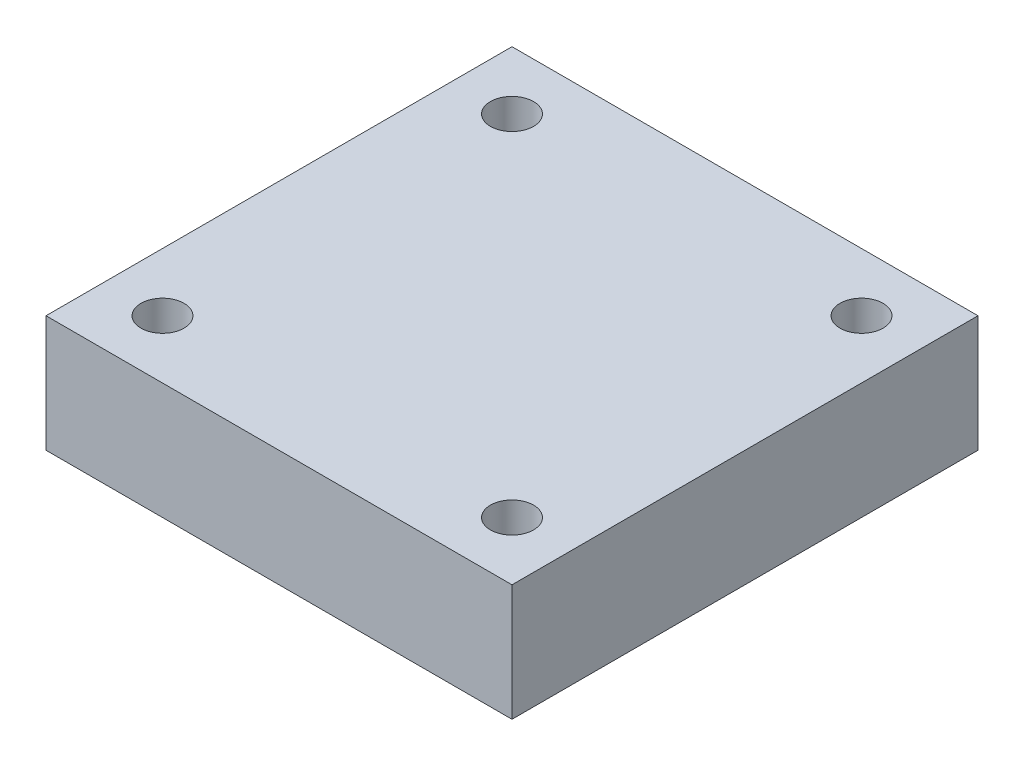
ISO-10303-21;
HEADER;
FILE_DESCRIPTION(('STEP AP214'),'2;1');
FILE_NAME('part.step','',(''),(''),'','','');
FILE_SCHEMA(('AUTOMOTIVE_DESIGN { 1 0 10303 214 1 1 1 1 }'));
ENDSEC;
DATA;
#1=APPLICATION_CONTEXT('core data for automotive mechanical design processes');
#2=APPLICATION_PROTOCOL_DEFINITION('international standard','automotive_design',2000,#1);
#3=PRODUCT_CONTEXT('',#1,'mechanical');
#4=PRODUCT('Part','Part','',(#3));
#5=PRODUCT_RELATED_PRODUCT_CATEGORY('part','',(#4));
#6=PRODUCT_DEFINITION_FORMATION('','',#4);
#7=PRODUCT_DEFINITION_CONTEXT('part definition',#1,'design');
#8=PRODUCT_DEFINITION('design','',#6,#7);
#9=PRODUCT_DEFINITION_SHAPE('','',#8);
#10=(LENGTH_UNIT() NAMED_UNIT(*) SI_UNIT(.MILLI.,.METRE.));
#11=(NAMED_UNIT(*) PLANE_ANGLE_UNIT() SI_UNIT($,.RADIAN.));
#12=(NAMED_UNIT(*) SI_UNIT($,.STERADIAN.) SOLID_ANGLE_UNIT());
#13=UNCERTAINTY_MEASURE_WITH_UNIT(LENGTH_MEASURE(1.E-05),#10,'distance_accuracy_value','');
#14=(GEOMETRIC_REPRESENTATION_CONTEXT(3) GLOBAL_UNCERTAINTY_ASSIGNED_CONTEXT((#13)) GLOBAL_UNIT_ASSIGNED_CONTEXT((#10,
#11,#12)) REPRESENTATION_CONTEXT('',''));
#15=CARTESIAN_POINT('',(0.,0.,0.));
#16=DIRECTION('',(0.,0.,1.));
#17=DIRECTION('',(1.,0.,0.));
#18=AXIS2_PLACEMENT_3D('',#15,#16,#17);
#19=CARTESIAN_POINT('',(0.,10.,0.));
#20=DIRECTION('',(0.,-1.,0.));
#21=DIRECTION('',(0.,0.,-1.));
#22=AXIS2_PLACEMENT_3D('',#19,#20,#21);
#23=PLANE('',#22);
#24=DIRECTION('',(0.,0.,-1.));
#25=VECTOR('',#24,1.);
#26=CARTESIAN_POINT('',(20.,10.,20.));
#27=LINE('',#26,#25);
#28=CARTESIAN_POINT('',(20.,10.,20.));
#29=VERTEX_POINT('',#28);
#30=CARTESIAN_POINT('',(20.,10.,-20.));
#31=VERTEX_POINT('',#30);
#32=EDGE_CURVE('E92',#29,#31,#27,.T.);
#33=ORIENTED_EDGE('',*,*,#32,.T.);
#34=DIRECTION('',(-1.,0.,0.));
#35=VECTOR('',#34,1.);
#36=CARTESIAN_POINT('',(-20.,10.,-20.));
#37=LINE('',#36,#35);
#38=CARTESIAN_POINT('',(-20.,10.,-20.));
#39=VERTEX_POINT('',#38);
#40=EDGE_CURVE('E87',#31,#39,#37,.T.);
#41=ORIENTED_EDGE('',*,*,#40,.T.);
#42=DIRECTION('',(0.,0.,1.));
#43=VECTOR('',#42,1.);
#44=CARTESIAN_POINT('',(-20.,10.,20.));
#45=LINE('',#44,#43);
#46=CARTESIAN_POINT('',(-20.,10.,20.));
#47=VERTEX_POINT('',#46);
#48=EDGE_CURVE('E90',#39,#47,#45,.T.);
#49=ORIENTED_EDGE('',*,*,#48,.T.);
#50=DIRECTION('',(1.,0.,0.));
#51=VECTOR('',#50,1.);
#52=CARTESIAN_POINT('',(-20.,10.,20.));
#53=LINE('',#52,#51);
#54=EDGE_CURVE('E57',#47,#29,#53,.T.);
#55=ORIENTED_EDGE('',*,*,#54,.T.);
#56=EDGE_LOOP('',(#33,#41,#49,#55));
#57=FACE_BOUND('',#56,.T.);
#58=CARTESIAN_POINT('',(-15.,10.,-15.));
#59=DIRECTION('',(0.,1.,0.));
#60=DIRECTION('',(0.,0.,1.));
#61=AXIS2_PLACEMENT_3D('',#58,#59,#60);
#62=CIRCLE('',#61,1.85);
#63=CARTESIAN_POINT('',(-15.,10.,-13.15));
#64=VERTEX_POINT('',#63);
#65=EDGE_CURVE('E112',#64,#64,#62,.T.);
#66=ORIENTED_EDGE('',*,*,#65,.F.);
#67=EDGE_LOOP('',(#66));
#68=FACE_BOUND('',#67,.T.);
#69=CARTESIAN_POINT('',(15.,10.,15.));
#70=DIRECTION('',(0.,1.,0.));
#71=DIRECTION('',(0.,0.,-1.));
#72=AXIS2_PLACEMENT_3D('',#69,#70,#71);
#73=CIRCLE('',#72,1.85000000000001);
#74=CARTESIAN_POINT('',(15.,10.,13.15));
#75=VERTEX_POINT('',#74);
#76=EDGE_CURVE('E134',#75,#75,#73,.T.);
#77=ORIENTED_EDGE('',*,*,#76,.F.);
#78=EDGE_LOOP('',(#77));
#79=FACE_BOUND('',#78,.T.);
#80=CARTESIAN_POINT('',(15.,10.,-15.));
#81=DIRECTION('',(0.,1.,0.));
#82=DIRECTION('',(0.,0.,1.));
#83=AXIS2_PLACEMENT_3D('',#80,#81,#82);
#84=CIRCLE('',#83,1.85000000000001);
#85=CARTESIAN_POINT('',(15.,10.,-13.15));
#86=VERTEX_POINT('',#85);
#87=EDGE_CURVE('E142',#86,#86,#84,.T.);
#88=ORIENTED_EDGE('',*,*,#87,.F.);
#89=EDGE_LOOP('',(#88));
#90=FACE_BOUND('',#89,.T.);
#91=CARTESIAN_POINT('',(-15.,10.,15.));
#92=DIRECTION('',(0.,1.,0.));
#93=DIRECTION('',(0.,0.,-1.));
#94=AXIS2_PLACEMENT_3D('',#91,#92,#93);
#95=CIRCLE('',#94,1.85);
#96=CARTESIAN_POINT('',(-15.,10.,13.15));
#97=VERTEX_POINT('',#96);
#98=EDGE_CURVE('E150',#97,#97,#95,.T.);
#99=ORIENTED_EDGE('',*,*,#98,.F.);
#100=EDGE_LOOP('',(#99));
#101=FACE_BOUND('',#100,.T.);
#102=ADVANCED_FACE('F39',(#57,#68,#79,#90,#101),#23,.F.);
#103=CARTESIAN_POINT('',(0.,0.,0.));
#104=DIRECTION('',(0.,-1.,0.));
#105=DIRECTION('',(0.,0.,-1.));
#106=AXIS2_PLACEMENT_3D('',#103,#104,#105);
#107=PLANE('',#106);
#108=CARTESIAN_POINT('',(15.,0.,-15.));
#109=DIRECTION('',(0.,1.,0.));
#110=DIRECTION('',(0.,0.,1.));
#111=AXIS2_PLACEMENT_3D('',#108,#109,#110);
#112=CIRCLE('',#111,1.85000000000001);
#113=CARTESIAN_POINT('',(15.,0.,-13.15));
#114=VERTEX_POINT('',#113);
#115=EDGE_CURVE('E146',#114,#114,#112,.T.);
#116=ORIENTED_EDGE('',*,*,#115,.T.);
#117=EDGE_LOOP('',(#116));
#118=FACE_BOUND('',#117,.T.);
#119=CARTESIAN_POINT('',(-15.,0.,-15.));
#120=DIRECTION('',(0.,1.,0.));
#121=DIRECTION('',(0.,0.,1.));
#122=AXIS2_PLACEMENT_3D('',#119,#120,#121);
#123=CIRCLE('',#122,1.85);
#124=CARTESIAN_POINT('',(-15.,0.,-13.15));
#125=VERTEX_POINT('',#124);
#126=EDGE_CURVE('E130',#125,#125,#123,.T.);
#127=ORIENTED_EDGE('',*,*,#126,.T.);
#128=EDGE_LOOP('',(#127));
#129=FACE_BOUND('',#128,.T.);
#130=DIRECTION('',(0.,0.,-1.));
#131=VECTOR('',#130,1.);
#132=CARTESIAN_POINT('',(20.,0.,20.));
#133=LINE('',#132,#131);
#134=CARTESIAN_POINT('',(20.,0.,20.));
#135=VERTEX_POINT('',#134);
#136=CARTESIAN_POINT('',(20.,0.,-20.));
#137=VERTEX_POINT('',#136);
#138=EDGE_CURVE('E108',#135,#137,#133,.T.);
#139=ORIENTED_EDGE('',*,*,#138,.F.);
#140=DIRECTION('',(1.,0.,0.));
#141=VECTOR('',#140,1.);
#142=CARTESIAN_POINT('',(-20.,0.,20.));
#143=LINE('',#142,#141);
#144=CARTESIAN_POINT('',(-20.,0.,20.));
#145=VERTEX_POINT('',#144);
#146=EDGE_CURVE('E80',#145,#135,#143,.T.);
#147=ORIENTED_EDGE('',*,*,#146,.F.);
#148=DIRECTION('',(0.,0.,1.));
#149=VECTOR('',#148,1.);
#150=CARTESIAN_POINT('',(-20.,0.,20.));
#151=LINE('',#150,#149);
#152=CARTESIAN_POINT('',(-20.,0.,-20.));
#153=VERTEX_POINT('',#152);
#154=EDGE_CURVE('E74',#153,#145,#151,.T.);
#155=ORIENTED_EDGE('',*,*,#154,.F.);
#156=DIRECTION('',(-1.,0.,0.));
#157=VECTOR('',#156,1.);
#158=CARTESIAN_POINT('',(-20.,0.,-20.));
#159=LINE('',#158,#157);
#160=EDGE_CURVE('E97',#137,#153,#159,.T.);
#161=ORIENTED_EDGE('',*,*,#160,.F.);
#162=EDGE_LOOP('',(#139,#147,#155,#161));
#163=FACE_BOUND('',#162,.T.);
#164=CARTESIAN_POINT('',(15.,0.,15.));
#165=DIRECTION('',(0.,1.,0.));
#166=DIRECTION('',(0.,0.,-1.));
#167=AXIS2_PLACEMENT_3D('',#164,#165,#166);
#168=CIRCLE('',#167,1.85000000000001);
#169=CARTESIAN_POINT('',(15.,0.,13.15));
#170=VERTEX_POINT('',#169);
#171=EDGE_CURVE('E138',#170,#170,#168,.T.);
#172=ORIENTED_EDGE('',*,*,#171,.T.);
#173=EDGE_LOOP('',(#172));
#174=FACE_BOUND('',#173,.T.);
#175=CARTESIAN_POINT('',(-15.,0.,15.));
#176=DIRECTION('',(0.,1.,0.));
#177=DIRECTION('',(0.,0.,-1.));
#178=AXIS2_PLACEMENT_3D('',#175,#176,#177);
#179=CIRCLE('',#178,1.85);
#180=CARTESIAN_POINT('',(-15.,0.,13.15));
#181=VERTEX_POINT('',#180);
#182=EDGE_CURVE('E154',#181,#181,#179,.T.);
#183=ORIENTED_EDGE('',*,*,#182,.T.);
#184=EDGE_LOOP('',(#183));
#185=FACE_BOUND('',#184,.T.);
#186=ADVANCED_FACE('F125',(#118,#129,#163,#174,#185),#107,.T.);
#187=CARTESIAN_POINT('',(20.,10.,20.));
#188=DIRECTION('',(-1.,0.,0.));
#189=DIRECTION('',(0.,0.,1.));
#190=AXIS2_PLACEMENT_3D('',#187,#188,#189);
#191=PLANE('',#190);
#192=ORIENTED_EDGE('',*,*,#138,.T.);
#193=DIRECTION('',(0.,-1.,0.));
#194=VECTOR('',#193,1.);
#195=CARTESIAN_POINT('',(20.,10.,-20.));
#196=LINE('',#195,#194);
#197=EDGE_CURVE('E11',#31,#137,#196,.T.);
#198=ORIENTED_EDGE('',*,*,#197,.F.);
#199=ORIENTED_EDGE('',*,*,#32,.F.);
#200=DIRECTION('',(0.,-1.,0.));
#201=VECTOR('',#200,1.);
#202=CARTESIAN_POINT('',(20.,10.,20.));
#203=LINE('',#202,#201);
#204=EDGE_CURVE('E104',#29,#135,#203,.T.);
#205=ORIENTED_EDGE('',*,*,#204,.T.);
#206=EDGE_LOOP('',(#192,#198,#199,#205));
#207=FACE_BOUND('',#206,.T.);
#208=ADVANCED_FACE('F41',(#207),#191,.F.);
#209=CARTESIAN_POINT('',(-20.,10.,-20.));
#210=DIRECTION('',(0.,0.,1.));
#211=DIRECTION('',(1.,0.,0.));
#212=AXIS2_PLACEMENT_3D('',#209,#210,#211);
#213=PLANE('',#212);
#214=ORIENTED_EDGE('',*,*,#160,.T.);
#215=DIRECTION('',(0.,-1.,0.));
#216=VECTOR('',#215,1.);
#217=CARTESIAN_POINT('',(-20.,10.,-20.));
#218=LINE('',#217,#216);
#219=EDGE_CURVE('E49',#39,#153,#218,.T.);
#220=ORIENTED_EDGE('',*,*,#219,.F.);
#221=ORIENTED_EDGE('',*,*,#40,.F.);
#222=ORIENTED_EDGE('',*,*,#197,.T.);
#223=EDGE_LOOP('',(#214,#220,#221,#222));
#224=FACE_BOUND('',#223,.T.);
#225=ADVANCED_FACE('F96',(#224),#213,.F.);
#226=CARTESIAN_POINT('',(-20.,10.,20.));
#227=DIRECTION('',(1.,0.,0.));
#228=DIRECTION('',(0.,0.,-1.));
#229=AXIS2_PLACEMENT_3D('',#226,#227,#228);
#230=PLANE('',#229);
#231=ORIENTED_EDGE('',*,*,#154,.T.);
#232=DIRECTION('',(0.,-1.,0.));
#233=VECTOR('',#232,1.);
#234=CARTESIAN_POINT('',(-20.,10.,20.));
#235=LINE('',#234,#233);
#236=EDGE_CURVE('E99',#47,#145,#235,.T.);
#237=ORIENTED_EDGE('',*,*,#236,.F.);
#238=ORIENTED_EDGE('',*,*,#48,.F.);
#239=ORIENTED_EDGE('',*,*,#219,.T.);
#240=EDGE_LOOP('',(#231,#237,#238,#239));
#241=FACE_BOUND('',#240,.T.);
#242=ADVANCED_FACE('F100',(#241),#230,.F.);
#243=CARTESIAN_POINT('',(-20.,10.,20.));
#244=DIRECTION('',(0.,0.,-1.));
#245=DIRECTION('',(-1.,0.,0.));
#246=AXIS2_PLACEMENT_3D('',#243,#244,#245);
#247=PLANE('',#246);
#248=ORIENTED_EDGE('',*,*,#146,.T.);
#249=ORIENTED_EDGE('',*,*,#204,.F.);
#250=ORIENTED_EDGE('',*,*,#54,.F.);
#251=ORIENTED_EDGE('',*,*,#236,.T.);
#252=EDGE_LOOP('',(#248,#249,#250,#251));
#253=FACE_BOUND('',#252,.T.);
#254=ADVANCED_FACE('F122',(#253),#247,.F.);
#255=CARTESIAN_POINT('',(-15.,10.,-15.));
#256=DIRECTION('',(0.,-1.,0.));
#257=DIRECTION('',(0.,0.,-1.));
#258=AXIS2_PLACEMENT_3D('',#255,#256,#257);
#259=CYLINDRICAL_SURFACE('',#258,1.85);
#260=ORIENTED_EDGE('',*,*,#65,.T.);
#261=EDGE_LOOP('',(#260));
#262=FACE_BOUND('',#261,.T.);
#263=ORIENTED_EDGE('',*,*,#126,.F.);
#264=EDGE_LOOP('',(#263));
#265=FACE_BOUND('',#264,.T.);
#266=ADVANCED_FACE('F173',(#262,#265),#259,.F.);
#267=CARTESIAN_POINT('',(15.,10.,15.));
#268=DIRECTION('',(0.,-1.,0.));
#269=DIRECTION('',(0.,0.,-1.));
#270=AXIS2_PLACEMENT_3D('',#267,#268,#269);
#271=CYLINDRICAL_SURFACE('',#270,1.85000000000001);
#272=ORIENTED_EDGE('',*,*,#76,.T.);
#273=EDGE_LOOP('',(#272));
#274=FACE_BOUND('',#273,.T.);
#275=ORIENTED_EDGE('',*,*,#171,.F.);
#276=EDGE_LOOP('',(#275));
#277=FACE_BOUND('',#276,.T.);
#278=ADVANCED_FACE('F219',(#274,#277),#271,.F.);
#279=CARTESIAN_POINT('',(15.,10.,-15.));
#280=DIRECTION('',(0.,-1.,0.));
#281=DIRECTION('',(0.,0.,-1.));
#282=AXIS2_PLACEMENT_3D('',#279,#280,#281);
#283=CYLINDRICAL_SURFACE('',#282,1.85000000000001);
#284=ORIENTED_EDGE('',*,*,#87,.T.);
#285=EDGE_LOOP('',(#284));
#286=FACE_BOUND('',#285,.T.);
#287=ORIENTED_EDGE('',*,*,#115,.F.);
#288=EDGE_LOOP('',(#287));
#289=FACE_BOUND('',#288,.T.);
#290=ADVANCED_FACE('F227',(#286,#289),#283,.F.);
#291=CARTESIAN_POINT('',(-15.,10.,15.));
#292=DIRECTION('',(0.,-1.,0.));
#293=DIRECTION('',(0.,0.,-1.));
#294=AXIS2_PLACEMENT_3D('',#291,#292,#293);
#295=CYLINDRICAL_SURFACE('',#294,1.85);
#296=ORIENTED_EDGE('',*,*,#98,.T.);
#297=EDGE_LOOP('',(#296));
#298=FACE_BOUND('',#297,.T.);
#299=ORIENTED_EDGE('',*,*,#182,.F.);
#300=EDGE_LOOP('',(#299));
#301=FACE_BOUND('',#300,.T.);
#302=ADVANCED_FACE('F162',(#298,#301),#295,.F.);
#303=CLOSED_SHELL('',(#102,#186,#208,#225,#242,#254,#266,#278,#290,#302));
#304=MANIFOLD_SOLID_BREP('B2',#303);
#305=ADVANCED_BREP_SHAPE_REPRESENTATION('',(#18,#304),#14);
#306=SHAPE_DEFINITION_REPRESENTATION(#9,#305);
ENDSEC;
END-ISO-10303-21;
